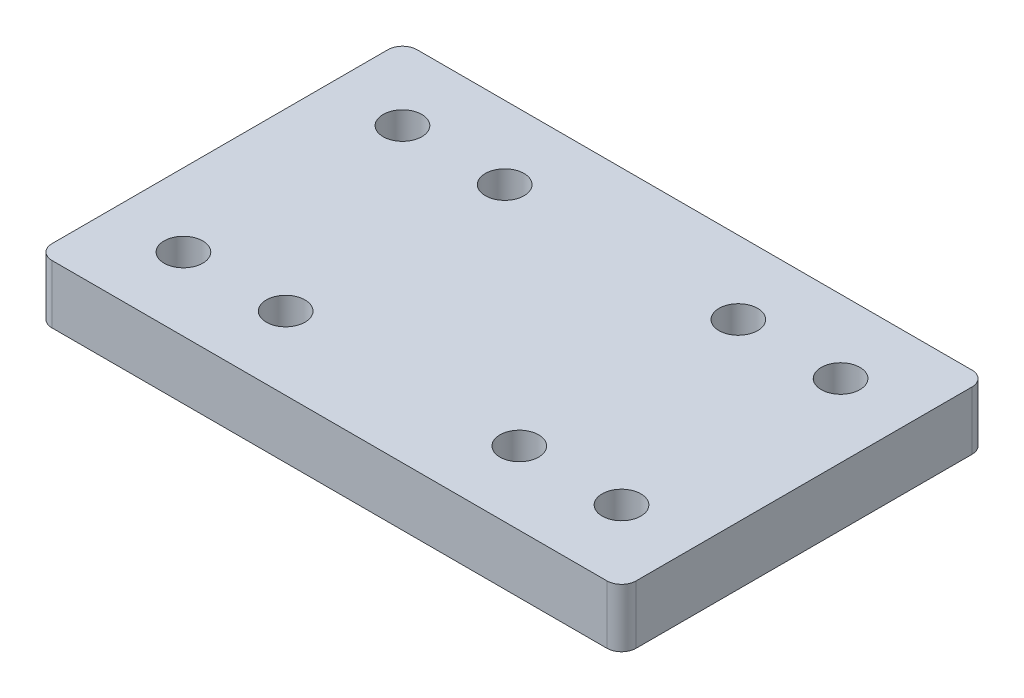
ISO-10303-21;
HEADER;
FILE_DESCRIPTION(('STEP AP214'),'2;1');
FILE_NAME('part.step','',(''),(''),'','','');
FILE_SCHEMA(('AUTOMOTIVE_DESIGN { 1 0 10303 214 1 1 1 1 }'));
ENDSEC;
DATA;
#1=APPLICATION_CONTEXT('core data for automotive mechanical design processes');
#2=APPLICATION_PROTOCOL_DEFINITION('international standard','automotive_design',2000,#1);
#3=PRODUCT_CONTEXT('',#1,'mechanical');
#4=PRODUCT('Part','Part','',(#3));
#5=PRODUCT_RELATED_PRODUCT_CATEGORY('part','',(#4));
#6=PRODUCT_DEFINITION_FORMATION('','',#4);
#7=PRODUCT_DEFINITION_CONTEXT('part definition',#1,'design');
#8=PRODUCT_DEFINITION('design','',#6,#7);
#9=PRODUCT_DEFINITION_SHAPE('','',#8);
#10=(LENGTH_UNIT() NAMED_UNIT(*) SI_UNIT(.MILLI.,.METRE.));
#11=(NAMED_UNIT(*) PLANE_ANGLE_UNIT() SI_UNIT($,.RADIAN.));
#12=(NAMED_UNIT(*) SI_UNIT($,.STERADIAN.) SOLID_ANGLE_UNIT());
#13=UNCERTAINTY_MEASURE_WITH_UNIT(LENGTH_MEASURE(1.E-05),#10,'distance_accuracy_value','');
#14=(GEOMETRIC_REPRESENTATION_CONTEXT(3) GLOBAL_UNCERTAINTY_ASSIGNED_CONTEXT((#13)) GLOBAL_UNIT_ASSIGNED_CONTEXT((#10,
#11,#12)) REPRESENTATION_CONTEXT('',''));
#15=CARTESIAN_POINT('',(0.,0.,0.));
#16=DIRECTION('',(0.,0.,1.));
#17=DIRECTION('',(1.,0.,0.));
#18=AXIS2_PLACEMENT_3D('',#15,#16,#17);
#19=CARTESIAN_POINT('',(-40.,8.,25.));
#20=DIRECTION('',(1.,0.,0.));
#21=DIRECTION('',(0.,0.,-1.));
#22=AXIS2_PLACEMENT_3D('',#19,#20,#21);
#23=PLANE('',#22);
#24=DIRECTION('',(0.,0.,1.));
#25=VECTOR('',#24,1.);
#26=CARTESIAN_POINT('',(-40.,8.,25.));
#27=LINE('',#26,#25);
#28=CARTESIAN_POINT('',(-40.,8.,-23.));
#29=VERTEX_POINT('',#28);
#30=CARTESIAN_POINT('',(-40.,8.,23.));
#31=VERTEX_POINT('',#30);
#32=EDGE_CURVE('E128',#29,#31,#27,.T.);
#33=ORIENTED_EDGE('',*,*,#32,.F.);
#34=DIRECTION('',(0.,-1.,0.));
#35=VECTOR('',#34,1.);
#36=CARTESIAN_POINT('',(-40.,8.,-23.));
#37=LINE('',#36,#35);
#38=CARTESIAN_POINT('',(-40.,0.,-23.));
#39=VERTEX_POINT('',#38);
#40=EDGE_CURVE('E11',#29,#39,#37,.T.);
#41=ORIENTED_EDGE('',*,*,#40,.T.);
#42=DIRECTION('',(0.,0.,1.));
#43=VECTOR('',#42,1.);
#44=CARTESIAN_POINT('',(-40.,0.,25.));
#45=LINE('',#44,#43);
#46=CARTESIAN_POINT('',(-40.,0.,23.));
#47=VERTEX_POINT('',#46);
#48=EDGE_CURVE('E130',#39,#47,#45,.T.);
#49=ORIENTED_EDGE('',*,*,#48,.T.);
#50=DIRECTION('',(0.,-1.,0.));
#51=VECTOR('',#50,1.);
#52=CARTESIAN_POINT('',(-40.,8.,23.));
#53=LINE('',#52,#51);
#54=EDGE_CURVE('E41',#47,#31,#53,.F.);
#55=ORIENTED_EDGE('',*,*,#54,.T.);
#56=EDGE_LOOP('',(#33,#41,#49,#55));
#57=FACE_BOUND('',#56,.T.);
#58=ADVANCED_FACE('F33',(#57),#23,.F.);
#59=CARTESIAN_POINT('',(40.,8.,25.));
#60=DIRECTION('',(0.,0.,-1.));
#61=DIRECTION('',(-1.,0.,0.));
#62=AXIS2_PLACEMENT_3D('',#59,#60,#61);
#63=PLANE('',#62);
#64=DIRECTION('',(1.,0.,0.));
#65=VECTOR('',#64,1.);
#66=CARTESIAN_POINT('',(40.,0.,25.));
#67=LINE('',#66,#65);
#68=CARTESIAN_POINT('',(-38.,0.,25.));
#69=VERTEX_POINT('',#68);
#70=CARTESIAN_POINT('',(38.,0.,25.));
#71=VERTEX_POINT('',#70);
#72=EDGE_CURVE('E126',#69,#71,#67,.T.);
#73=ORIENTED_EDGE('',*,*,#72,.T.);
#74=DIRECTION('',(0.,-1.,0.));
#75=VECTOR('',#74,1.);
#76=CARTESIAN_POINT('',(38.,8.,25.));
#77=LINE('',#76,#75);
#78=CARTESIAN_POINT('',(38.,8.,25.));
#79=VERTEX_POINT('',#78);
#80=EDGE_CURVE('E105',#71,#79,#77,.F.);
#81=ORIENTED_EDGE('',*,*,#80,.T.);
#82=DIRECTION('',(1.,0.,0.));
#83=VECTOR('',#82,1.);
#84=CARTESIAN_POINT('',(40.,8.,25.));
#85=LINE('',#84,#83);
#86=CARTESIAN_POINT('',(-38.,8.,25.));
#87=VERTEX_POINT('',#86);
#88=EDGE_CURVE('E166',#87,#79,#85,.T.);
#89=ORIENTED_EDGE('',*,*,#88,.F.);
#90=DIRECTION('',(0.,-1.,0.));
#91=VECTOR('',#90,1.);
#92=CARTESIAN_POINT('',(-38.,8.,25.));
#93=LINE('',#92,#91);
#94=EDGE_CURVE('E110',#87,#69,#93,.T.);
#95=ORIENTED_EDGE('',*,*,#94,.T.);
#96=EDGE_LOOP('',(#73,#81,#89,#95));
#97=FACE_BOUND('',#96,.T.);
#98=ADVANCED_FACE('F170',(#97),#63,.F.);
#99=CARTESIAN_POINT('',(40.,8.,25.));
#100=DIRECTION('',(-1.,0.,0.));
#101=DIRECTION('',(0.,0.,1.));
#102=AXIS2_PLACEMENT_3D('',#99,#100,#101);
#103=PLANE('',#102);
#104=DIRECTION('',(0.,0.,-1.));
#105=VECTOR('',#104,1.);
#106=CARTESIAN_POINT('',(40.,8.,25.));
#107=LINE('',#106,#105);
#108=CARTESIAN_POINT('',(40.,8.,23.));
#109=VERTEX_POINT('',#108);
#110=CARTESIAN_POINT('',(40.,8.,-23.));
#111=VERTEX_POINT('',#110);
#112=EDGE_CURVE('E119',#109,#111,#107,.T.);
#113=ORIENTED_EDGE('',*,*,#112,.F.);
#114=DIRECTION('',(0.,-1.,0.));
#115=VECTOR('',#114,1.);
#116=CARTESIAN_POINT('',(40.,8.,23.));
#117=LINE('',#116,#115);
#118=CARTESIAN_POINT('',(40.,0.,23.));
#119=VERTEX_POINT('',#118);
#120=EDGE_CURVE('E104',#109,#119,#117,.T.);
#121=ORIENTED_EDGE('',*,*,#120,.T.);
#122=DIRECTION('',(0.,0.,-1.));
#123=VECTOR('',#122,1.);
#124=CARTESIAN_POINT('',(40.,0.,25.));
#125=LINE('',#124,#123);
#126=CARTESIAN_POINT('',(40.,0.,-23.));
#127=VERTEX_POINT('',#126);
#128=EDGE_CURVE('E117',#119,#127,#125,.T.);
#129=ORIENTED_EDGE('',*,*,#128,.T.);
#130=DIRECTION('',(0.,-1.,0.));
#131=VECTOR('',#130,1.);
#132=CARTESIAN_POINT('',(40.,8.,-23.));
#133=LINE('',#132,#131);
#134=EDGE_CURVE('E121',#127,#111,#133,.F.);
#135=ORIENTED_EDGE('',*,*,#134,.T.);
#136=EDGE_LOOP('',(#113,#121,#129,#135));
#137=FACE_BOUND('',#136,.T.);
#138=ADVANCED_FACE('F116',(#137),#103,.F.);
#139=CARTESIAN_POINT('',(40.,8.,-25.));
#140=DIRECTION('',(0.,0.,1.));
#141=DIRECTION('',(1.,0.,0.));
#142=AXIS2_PLACEMENT_3D('',#139,#140,#141);
#143=PLANE('',#142);
#144=DIRECTION('',(-1.,0.,0.));
#145=VECTOR('',#144,1.);
#146=CARTESIAN_POINT('',(40.,8.,-25.));
#147=LINE('',#146,#145);
#148=CARTESIAN_POINT('',(38.,8.,-25.));
#149=VERTEX_POINT('',#148);
#150=CARTESIAN_POINT('',(-38.,8.,-25.));
#151=VERTEX_POINT('',#150);
#152=EDGE_CURVE('E134',#149,#151,#147,.T.);
#153=ORIENTED_EDGE('',*,*,#152,.F.);
#154=DIRECTION('',(0.,-1.,0.));
#155=VECTOR('',#154,1.);
#156=CARTESIAN_POINT('',(38.,8.,-25.));
#157=LINE('',#156,#155);
#158=CARTESIAN_POINT('',(38.,0.,-25.));
#159=VERTEX_POINT('',#158);
#160=EDGE_CURVE('E151',#149,#159,#157,.T.);
#161=ORIENTED_EDGE('',*,*,#160,.T.);
#162=DIRECTION('',(-1.,0.,0.));
#163=VECTOR('',#162,1.);
#164=CARTESIAN_POINT('',(40.,0.,-25.));
#165=LINE('',#164,#163);
#166=CARTESIAN_POINT('',(-38.,0.,-25.));
#167=VERTEX_POINT('',#166);
#168=EDGE_CURVE('E125',#159,#167,#165,.T.);
#169=ORIENTED_EDGE('',*,*,#168,.T.);
#170=DIRECTION('',(0.,-1.,0.));
#171=VECTOR('',#170,1.);
#172=CARTESIAN_POINT('',(-38.,8.,-25.));
#173=LINE('',#172,#171);
#174=EDGE_CURVE('E48',#167,#151,#173,.F.);
#175=ORIENTED_EDGE('',*,*,#174,.T.);
#176=EDGE_LOOP('',(#153,#161,#169,#175));
#177=FACE_BOUND('',#176,.T.);
#178=ADVANCED_FACE('F228',(#177),#143,.F.);
#179=CARTESIAN_POINT('',(0.,8.,0.));
#180=DIRECTION('',(0.,1.,0.));
#181=DIRECTION('',(0.,0.,1.));
#182=AXIS2_PLACEMENT_3D('',#179,#180,#181);
#183=PLANE('',#182);
#184=CARTESIAN_POINT('',(-30.,8.,-15.));
#185=DIRECTION('',(0.,1.,0.));
#186=DIRECTION('',(0.,0.,1.));
#187=AXIS2_PLACEMENT_3D('',#184,#185,#186);
#188=CIRCLE('',#187,2.64999999999999);
#189=CARTESIAN_POINT('',(-30.,8.,-12.35));
#190=VERTEX_POINT('',#189);
#191=EDGE_CURVE('E220',#190,#190,#188,.T.);
#192=ORIENTED_EDGE('',*,*,#191,.F.);
#193=EDGE_LOOP('',(#192));
#194=FACE_BOUND('',#193,.T.);
#195=CARTESIAN_POINT('',(-16.,8.,-15.));
#196=DIRECTION('',(0.,1.,0.));
#197=DIRECTION('',(0.,0.,1.));
#198=AXIS2_PLACEMENT_3D('',#195,#196,#197);
#199=CIRCLE('',#198,2.64999999999999);
#200=CARTESIAN_POINT('',(-16.,8.,-12.35));
#201=VERTEX_POINT('',#200);
#202=EDGE_CURVE('E214',#201,#201,#199,.T.);
#203=ORIENTED_EDGE('',*,*,#202,.F.);
#204=EDGE_LOOP('',(#203));
#205=FACE_BOUND('',#204,.T.);
#206=CARTESIAN_POINT('',(-16.,8.,15.));
#207=DIRECTION('',(0.,1.,0.));
#208=DIRECTION('',(0.,0.,1.));
#209=AXIS2_PLACEMENT_3D('',#206,#207,#208);
#210=CIRCLE('',#209,2.64999999999999);
#211=CARTESIAN_POINT('',(-16.,8.,17.65));
#212=VERTEX_POINT('',#211);
#213=EDGE_CURVE('E208',#212,#212,#210,.T.);
#214=ORIENTED_EDGE('',*,*,#213,.F.);
#215=EDGE_LOOP('',(#214));
#216=FACE_BOUND('',#215,.T.);
#217=CARTESIAN_POINT('',(-30.,8.,15.));
#218=DIRECTION('',(0.,1.,0.));
#219=DIRECTION('',(0.,0.,1.));
#220=AXIS2_PLACEMENT_3D('',#217,#218,#219);
#221=CIRCLE('',#220,2.64999999999999);
#222=CARTESIAN_POINT('',(-30.,8.,17.65));
#223=VERTEX_POINT('',#222);
#224=EDGE_CURVE('E202',#223,#223,#221,.T.);
#225=ORIENTED_EDGE('',*,*,#224,.F.);
#226=EDGE_LOOP('',(#225));
#227=FACE_BOUND('',#226,.T.);
#228=CARTESIAN_POINT('',(30.,8.,15.));
#229=DIRECTION('',(0.,1.,0.));
#230=DIRECTION('',(0.,0.,1.));
#231=AXIS2_PLACEMENT_3D('',#228,#229,#230);
#232=CIRCLE('',#231,2.64999999999999);
#233=CARTESIAN_POINT('',(30.,8.,17.65));
#234=VERTEX_POINT('',#233);
#235=EDGE_CURVE('E196',#234,#234,#232,.T.);
#236=ORIENTED_EDGE('',*,*,#235,.F.);
#237=EDGE_LOOP('',(#236));
#238=FACE_BOUND('',#237,.T.);
#239=CARTESIAN_POINT('',(16.,8.,15.));
#240=DIRECTION('',(0.,1.,0.));
#241=DIRECTION('',(0.,0.,1.));
#242=AXIS2_PLACEMENT_3D('',#239,#240,#241);
#243=CIRCLE('',#242,2.64999999999999);
#244=CARTESIAN_POINT('',(16.,8.,17.65));
#245=VERTEX_POINT('',#244);
#246=EDGE_CURVE('E190',#245,#245,#243,.T.);
#247=ORIENTED_EDGE('',*,*,#246,.F.);
#248=EDGE_LOOP('',(#247));
#249=FACE_BOUND('',#248,.T.);
#250=CARTESIAN_POINT('',(16.,8.,-15.));
#251=DIRECTION('',(0.,1.,0.));
#252=DIRECTION('',(0.,0.,1.));
#253=AXIS2_PLACEMENT_3D('',#250,#251,#252);
#254=CIRCLE('',#253,2.64999999999999);
#255=CARTESIAN_POINT('',(16.,8.,-12.35));
#256=VERTEX_POINT('',#255);
#257=EDGE_CURVE('E184',#256,#256,#254,.T.);
#258=ORIENTED_EDGE('',*,*,#257,.F.);
#259=EDGE_LOOP('',(#258));
#260=FACE_BOUND('',#259,.T.);
#261=CARTESIAN_POINT('',(30.,8.,-15.));
#262=DIRECTION('',(0.,1.,0.));
#263=DIRECTION('',(0.,0.,1.));
#264=AXIS2_PLACEMENT_3D('',#261,#262,#263);
#265=CIRCLE('',#264,2.64999999999999);
#266=CARTESIAN_POINT('',(30.,8.,-12.35));
#267=VERTEX_POINT('',#266);
#268=EDGE_CURVE('E173',#267,#267,#265,.T.);
#269=ORIENTED_EDGE('',*,*,#268,.F.);
#270=EDGE_LOOP('',(#269));
#271=FACE_BOUND('',#270,.T.);
#272=ORIENTED_EDGE('',*,*,#88,.T.);
#273=CARTESIAN_POINT('',(38.,8.,23.));
#274=DIRECTION('',(0.,1.,0.));
#275=DIRECTION('',(0.,0.,1.));
#276=AXIS2_PLACEMENT_3D('',#273,#274,#275);
#277=CIRCLE('',#276,2.);
#278=EDGE_CURVE('E148',#79,#109,#277,.T.);
#279=ORIENTED_EDGE('',*,*,#278,.T.);
#280=ORIENTED_EDGE('',*,*,#112,.T.);
#281=CARTESIAN_POINT('',(38.,8.,-23.));
#282=DIRECTION('',(0.,1.,0.));
#283=DIRECTION('',(0.,0.,1.));
#284=AXIS2_PLACEMENT_3D('',#281,#282,#283);
#285=CIRCLE('',#284,2.);
#286=EDGE_CURVE('E55',#111,#149,#285,.T.);
#287=ORIENTED_EDGE('',*,*,#286,.T.);
#288=ORIENTED_EDGE('',*,*,#152,.T.);
#289=CARTESIAN_POINT('',(-38.,8.,-23.));
#290=DIRECTION('',(0.,1.,0.));
#291=DIRECTION('',(0.,0.,1.));
#292=AXIS2_PLACEMENT_3D('',#289,#290,#291);
#293=CIRCLE('',#292,2.);
#294=EDGE_CURVE('E145',#151,#29,#293,.T.);
#295=ORIENTED_EDGE('',*,*,#294,.T.);
#296=ORIENTED_EDGE('',*,*,#32,.T.);
#297=CARTESIAN_POINT('',(-38.,8.,23.));
#298=DIRECTION('',(0.,1.,0.));
#299=DIRECTION('',(0.,0.,1.));
#300=AXIS2_PLACEMENT_3D('',#297,#298,#299);
#301=CIRCLE('',#300,2.);
#302=EDGE_CURVE('E143',#31,#87,#301,.T.);
#303=ORIENTED_EDGE('',*,*,#302,.T.);
#304=EDGE_LOOP('',(#272,#279,#280,#287,#288,#295,#296,#303));
#305=FACE_BOUND('',#304,.T.);
#306=ADVANCED_FACE('F163',(#194,#205,#216,#227,#238,#249,#260,#271,#305),#183,.T.);
#307=CARTESIAN_POINT('',(0.,0.,0.));
#308=DIRECTION('',(0.,1.,0.));
#309=DIRECTION('',(0.,0.,1.));
#310=AXIS2_PLACEMENT_3D('',#307,#308,#309);
#311=PLANE('',#310);
#312=CARTESIAN_POINT('',(-30.,0.,-15.));
#313=DIRECTION('',(0.,1.,0.));
#314=DIRECTION('',(0.,0.,1.));
#315=AXIS2_PLACEMENT_3D('',#312,#313,#314);
#316=CIRCLE('',#315,2.64999999999999);
#317=CARTESIAN_POINT('',(-30.,0.,-12.35));
#318=VERTEX_POINT('',#317);
#319=EDGE_CURVE('E217',#318,#318,#316,.T.);
#320=ORIENTED_EDGE('',*,*,#319,.T.);
#321=EDGE_LOOP('',(#320));
#322=FACE_BOUND('',#321,.T.);
#323=CARTESIAN_POINT('',(-16.,0.,-15.));
#324=DIRECTION('',(0.,1.,0.));
#325=DIRECTION('',(0.,0.,1.));
#326=AXIS2_PLACEMENT_3D('',#323,#324,#325);
#327=CIRCLE('',#326,2.64999999999999);
#328=CARTESIAN_POINT('',(-16.,0.,-12.35));
#329=VERTEX_POINT('',#328);
#330=EDGE_CURVE('E211',#329,#329,#327,.T.);
#331=ORIENTED_EDGE('',*,*,#330,.T.);
#332=EDGE_LOOP('',(#331));
#333=FACE_BOUND('',#332,.T.);
#334=CARTESIAN_POINT('',(-16.,0.,15.));
#335=DIRECTION('',(0.,1.,0.));
#336=DIRECTION('',(0.,0.,1.));
#337=AXIS2_PLACEMENT_3D('',#334,#335,#336);
#338=CIRCLE('',#337,2.64999999999999);
#339=CARTESIAN_POINT('',(-16.,0.,17.65));
#340=VERTEX_POINT('',#339);
#341=EDGE_CURVE('E205',#340,#340,#338,.T.);
#342=ORIENTED_EDGE('',*,*,#341,.T.);
#343=EDGE_LOOP('',(#342));
#344=FACE_BOUND('',#343,.T.);
#345=CARTESIAN_POINT('',(-30.,0.,15.));
#346=DIRECTION('',(0.,1.,0.));
#347=DIRECTION('',(0.,0.,1.));
#348=AXIS2_PLACEMENT_3D('',#345,#346,#347);
#349=CIRCLE('',#348,2.64999999999999);
#350=CARTESIAN_POINT('',(-30.,0.,17.65));
#351=VERTEX_POINT('',#350);
#352=EDGE_CURVE('E199',#351,#351,#349,.T.);
#353=ORIENTED_EDGE('',*,*,#352,.T.);
#354=EDGE_LOOP('',(#353));
#355=FACE_BOUND('',#354,.T.);
#356=CARTESIAN_POINT('',(30.,0.,15.));
#357=DIRECTION('',(0.,1.,0.));
#358=DIRECTION('',(0.,0.,1.));
#359=AXIS2_PLACEMENT_3D('',#356,#357,#358);
#360=CIRCLE('',#359,2.64999999999999);
#361=CARTESIAN_POINT('',(30.,0.,17.65));
#362=VERTEX_POINT('',#361);
#363=EDGE_CURVE('E193',#362,#362,#360,.T.);
#364=ORIENTED_EDGE('',*,*,#363,.T.);
#365=EDGE_LOOP('',(#364));
#366=FACE_BOUND('',#365,.T.);
#367=CARTESIAN_POINT('',(16.,0.,15.));
#368=DIRECTION('',(0.,1.,0.));
#369=DIRECTION('',(0.,0.,1.));
#370=AXIS2_PLACEMENT_3D('',#367,#368,#369);
#371=CIRCLE('',#370,2.64999999999999);
#372=CARTESIAN_POINT('',(16.,0.,17.65));
#373=VERTEX_POINT('',#372);
#374=EDGE_CURVE('E187',#373,#373,#371,.T.);
#375=ORIENTED_EDGE('',*,*,#374,.T.);
#376=EDGE_LOOP('',(#375));
#377=FACE_BOUND('',#376,.T.);
#378=CARTESIAN_POINT('',(16.,0.,-15.));
#379=DIRECTION('',(0.,1.,0.));
#380=DIRECTION('',(0.,0.,1.));
#381=AXIS2_PLACEMENT_3D('',#378,#379,#380);
#382=CIRCLE('',#381,2.64999999999999);
#383=CARTESIAN_POINT('',(16.,0.,-12.35));
#384=VERTEX_POINT('',#383);
#385=EDGE_CURVE('E181',#384,#384,#382,.T.);
#386=ORIENTED_EDGE('',*,*,#385,.T.);
#387=EDGE_LOOP('',(#386));
#388=FACE_BOUND('',#387,.T.);
#389=CARTESIAN_POINT('',(30.,0.,-15.));
#390=DIRECTION('',(0.,1.,0.));
#391=DIRECTION('',(0.,0.,1.));
#392=AXIS2_PLACEMENT_3D('',#389,#390,#391);
#393=CIRCLE('',#392,2.64999999999999);
#394=CARTESIAN_POINT('',(30.,0.,-12.35));
#395=VERTEX_POINT('',#394);
#396=EDGE_CURVE('E171',#395,#395,#393,.T.);
#397=ORIENTED_EDGE('',*,*,#396,.T.);
#398=EDGE_LOOP('',(#397));
#399=FACE_BOUND('',#398,.T.);
#400=ORIENTED_EDGE('',*,*,#128,.F.);
#401=CARTESIAN_POINT('',(38.,0.,23.));
#402=DIRECTION('',(0.,1.,0.));
#403=DIRECTION('',(0.,0.,1.));
#404=AXIS2_PLACEMENT_3D('',#401,#402,#403);
#405=CIRCLE('',#404,2.);
#406=EDGE_CURVE('E100',#119,#71,#405,.F.);
#407=ORIENTED_EDGE('',*,*,#406,.T.);
#408=ORIENTED_EDGE('',*,*,#72,.F.);
#409=CARTESIAN_POINT('',(-38.,0.,23.));
#410=DIRECTION('',(0.,1.,0.));
#411=DIRECTION('',(0.,0.,1.));
#412=AXIS2_PLACEMENT_3D('',#409,#410,#411);
#413=CIRCLE('',#412,2.);
#414=EDGE_CURVE('E120',#69,#47,#413,.F.);
#415=ORIENTED_EDGE('',*,*,#414,.T.);
#416=ORIENTED_EDGE('',*,*,#48,.F.);
#417=CARTESIAN_POINT('',(-38.,0.,-23.));
#418=DIRECTION('',(0.,1.,0.));
#419=DIRECTION('',(0.,0.,1.));
#420=AXIS2_PLACEMENT_3D('',#417,#418,#419);
#421=CIRCLE('',#420,2.);
#422=EDGE_CURVE('E137',#39,#167,#421,.F.);
#423=ORIENTED_EDGE('',*,*,#422,.T.);
#424=ORIENTED_EDGE('',*,*,#168,.F.);
#425=CARTESIAN_POINT('',(38.,0.,-23.));
#426=DIRECTION('',(0.,1.,0.));
#427=DIRECTION('',(0.,0.,1.));
#428=AXIS2_PLACEMENT_3D('',#425,#426,#427);
#429=CIRCLE('',#428,2.);
#430=EDGE_CURVE('E111',#159,#127,#429,.F.);
#431=ORIENTED_EDGE('',*,*,#430,.T.);
#432=EDGE_LOOP('',(#400,#407,#408,#415,#416,#423,#424,#431));
#433=FACE_BOUND('',#432,.T.);
#434=ADVANCED_FACE('F123',(#322,#333,#344,#355,#366,#377,#388,#399,#433),#311,.F.);
#435=CARTESIAN_POINT('',(38.,8.,23.));
#436=DIRECTION('',(0.,-1.,0.));
#437=DIRECTION('',(0.,0.,-1.));
#438=AXIS2_PLACEMENT_3D('',#435,#436,#437);
#439=CYLINDRICAL_SURFACE('',#438,2.);
#440=ORIENTED_EDGE('',*,*,#278,.F.);
#441=ORIENTED_EDGE('',*,*,#80,.F.);
#442=ORIENTED_EDGE('',*,*,#406,.F.);
#443=ORIENTED_EDGE('',*,*,#120,.F.);
#444=EDGE_LOOP('',(#440,#441,#442,#443));
#445=FACE_BOUND('',#444,.T.);
#446=ADVANCED_FACE('F103',(#445),#439,.T.);
#447=CARTESIAN_POINT('',(38.,8.,-23.));
#448=DIRECTION('',(0.,-1.,0.));
#449=DIRECTION('',(0.,0.,-1.));
#450=AXIS2_PLACEMENT_3D('',#447,#448,#449);
#451=CYLINDRICAL_SURFACE('',#450,2.);
#452=ORIENTED_EDGE('',*,*,#286,.F.);
#453=ORIENTED_EDGE('',*,*,#134,.F.);
#454=ORIENTED_EDGE('',*,*,#430,.F.);
#455=ORIENTED_EDGE('',*,*,#160,.F.);
#456=EDGE_LOOP('',(#452,#453,#454,#455));
#457=FACE_BOUND('',#456,.T.);
#458=ADVANCED_FACE('F268',(#457),#451,.T.);
#459=CARTESIAN_POINT('',(-38.,8.,-23.));
#460=DIRECTION('',(0.,-1.,0.));
#461=DIRECTION('',(0.,0.,-1.));
#462=AXIS2_PLACEMENT_3D('',#459,#460,#461);
#463=CYLINDRICAL_SURFACE('',#462,2.);
#464=ORIENTED_EDGE('',*,*,#294,.F.);
#465=ORIENTED_EDGE('',*,*,#174,.F.);
#466=ORIENTED_EDGE('',*,*,#422,.F.);
#467=ORIENTED_EDGE('',*,*,#40,.F.);
#468=EDGE_LOOP('',(#464,#465,#466,#467));
#469=FACE_BOUND('',#468,.T.);
#470=ADVANCED_FACE('F256',(#469),#463,.T.);
#471=CARTESIAN_POINT('',(-38.,8.,23.));
#472=DIRECTION('',(0.,-1.,0.));
#473=DIRECTION('',(0.,0.,-1.));
#474=AXIS2_PLACEMENT_3D('',#471,#472,#473);
#475=CYLINDRICAL_SURFACE('',#474,2.);
#476=ORIENTED_EDGE('',*,*,#302,.F.);
#477=ORIENTED_EDGE('',*,*,#54,.F.);
#478=ORIENTED_EDGE('',*,*,#414,.F.);
#479=ORIENTED_EDGE('',*,*,#94,.F.);
#480=EDGE_LOOP('',(#476,#477,#478,#479));
#481=FACE_BOUND('',#480,.T.);
#482=ADVANCED_FACE('F35',(#481),#475,.T.);
#483=CARTESIAN_POINT('',(30.,8.,-15.));
#484=DIRECTION('',(0.,1.,0.));
#485=DIRECTION('',(0.,0.,1.));
#486=AXIS2_PLACEMENT_3D('',#483,#484,#485);
#487=CYLINDRICAL_SURFACE('',#486,2.64999999999999);
#488=ORIENTED_EDGE('',*,*,#396,.F.);
#489=EDGE_LOOP('',(#488));
#490=FACE_BOUND('',#489,.T.);
#491=ORIENTED_EDGE('',*,*,#268,.T.);
#492=EDGE_LOOP('',(#491));
#493=FACE_BOUND('',#492,.T.);
#494=ADVANCED_FACE('F244',(#490,#493),#487,.F.);
#495=CARTESIAN_POINT('',(16.,8.,-15.));
#496=DIRECTION('',(0.,1.,0.));
#497=DIRECTION('',(0.,0.,1.));
#498=AXIS2_PLACEMENT_3D('',#495,#496,#497);
#499=CYLINDRICAL_SURFACE('',#498,2.64999999999999);
#500=ORIENTED_EDGE('',*,*,#385,.F.);
#501=EDGE_LOOP('',(#500));
#502=FACE_BOUND('',#501,.T.);
#503=ORIENTED_EDGE('',*,*,#257,.T.);
#504=EDGE_LOOP('',(#503));
#505=FACE_BOUND('',#504,.T.);
#506=ADVANCED_FACE('F246',(#502,#505),#499,.F.);
#507=CARTESIAN_POINT('',(16.,8.,15.));
#508=DIRECTION('',(0.,1.,0.));
#509=DIRECTION('',(0.,0.,1.));
#510=AXIS2_PLACEMENT_3D('',#507,#508,#509);
#511=CYLINDRICAL_SURFACE('',#510,2.64999999999999);
#512=ORIENTED_EDGE('',*,*,#374,.F.);
#513=EDGE_LOOP('',(#512));
#514=FACE_BOUND('',#513,.T.);
#515=ORIENTED_EDGE('',*,*,#246,.T.);
#516=EDGE_LOOP('',(#515));
#517=FACE_BOUND('',#516,.T.);
#518=ADVANCED_FACE('F253',(#514,#517),#511,.F.);
#519=CARTESIAN_POINT('',(30.,8.,15.));
#520=DIRECTION('',(0.,1.,0.));
#521=DIRECTION('',(0.,0.,1.));
#522=AXIS2_PLACEMENT_3D('',#519,#520,#521);
#523=CYLINDRICAL_SURFACE('',#522,2.64999999999999);
#524=ORIENTED_EDGE('',*,*,#363,.F.);
#525=EDGE_LOOP('',(#524));
#526=FACE_BOUND('',#525,.T.);
#527=ORIENTED_EDGE('',*,*,#235,.T.);
#528=EDGE_LOOP('',(#527));
#529=FACE_BOUND('',#528,.T.);
#530=ADVANCED_FACE('F318',(#526,#529),#523,.F.);
#531=CARTESIAN_POINT('',(-30.,8.,15.));
#532=DIRECTION('',(0.,1.,0.));
#533=DIRECTION('',(0.,0.,1.));
#534=AXIS2_PLACEMENT_3D('',#531,#532,#533);
#535=CYLINDRICAL_SURFACE('',#534,2.64999999999999);
#536=ORIENTED_EDGE('',*,*,#352,.F.);
#537=EDGE_LOOP('',(#536));
#538=FACE_BOUND('',#537,.T.);
#539=ORIENTED_EDGE('',*,*,#224,.T.);
#540=EDGE_LOOP('',(#539));
#541=FACE_BOUND('',#540,.T.);
#542=ADVANCED_FACE('F328',(#538,#541),#535,.F.);
#543=CARTESIAN_POINT('',(-16.,8.,15.));
#544=DIRECTION('',(0.,1.,0.));
#545=DIRECTION('',(0.,0.,1.));
#546=AXIS2_PLACEMENT_3D('',#543,#544,#545);
#547=CYLINDRICAL_SURFACE('',#546,2.64999999999999);
#548=ORIENTED_EDGE('',*,*,#341,.F.);
#549=EDGE_LOOP('',(#548));
#550=FACE_BOUND('',#549,.T.);
#551=ORIENTED_EDGE('',*,*,#213,.T.);
#552=EDGE_LOOP('',(#551));
#553=FACE_BOUND('',#552,.T.);
#554=ADVANCED_FACE('F338',(#550,#553),#547,.F.);
#555=CARTESIAN_POINT('',(-16.,8.,-15.));
#556=DIRECTION('',(0.,1.,0.));
#557=DIRECTION('',(0.,0.,1.));
#558=AXIS2_PLACEMENT_3D('',#555,#556,#557);
#559=CYLINDRICAL_SURFACE('',#558,2.64999999999999);
#560=ORIENTED_EDGE('',*,*,#330,.F.);
#561=EDGE_LOOP('',(#560));
#562=FACE_BOUND('',#561,.T.);
#563=ORIENTED_EDGE('',*,*,#202,.T.);
#564=EDGE_LOOP('',(#563));
#565=FACE_BOUND('',#564,.T.);
#566=ADVANCED_FACE('F348',(#562,#565),#559,.F.);
#567=CARTESIAN_POINT('',(-30.,8.,-15.));
#568=DIRECTION('',(0.,1.,0.));
#569=DIRECTION('',(0.,0.,1.));
#570=AXIS2_PLACEMENT_3D('',#567,#568,#569);
#571=CYLINDRICAL_SURFACE('',#570,2.64999999999999);
#572=ORIENTED_EDGE('',*,*,#319,.F.);
#573=EDGE_LOOP('',(#572));
#574=FACE_BOUND('',#573,.T.);
#575=ORIENTED_EDGE('',*,*,#191,.T.);
#576=EDGE_LOOP('',(#575));
#577=FACE_BOUND('',#576,.T.);
#578=ADVANCED_FACE('F224',(#574,#577),#571,.F.);
#579=CLOSED_SHELL('',(#58,#98,#138,#178,#306,#434,#446,#458,#470,#482,#494,#506,#518,#530,#542,
#554,#566,#578));
#580=MANIFOLD_SOLID_BREP('B2',#579);
#581=ADVANCED_BREP_SHAPE_REPRESENTATION('',(#18,#580),#14);
#582=SHAPE_DEFINITION_REPRESENTATION(#9,#581);
ENDSEC;
END-ISO-10303-21;
